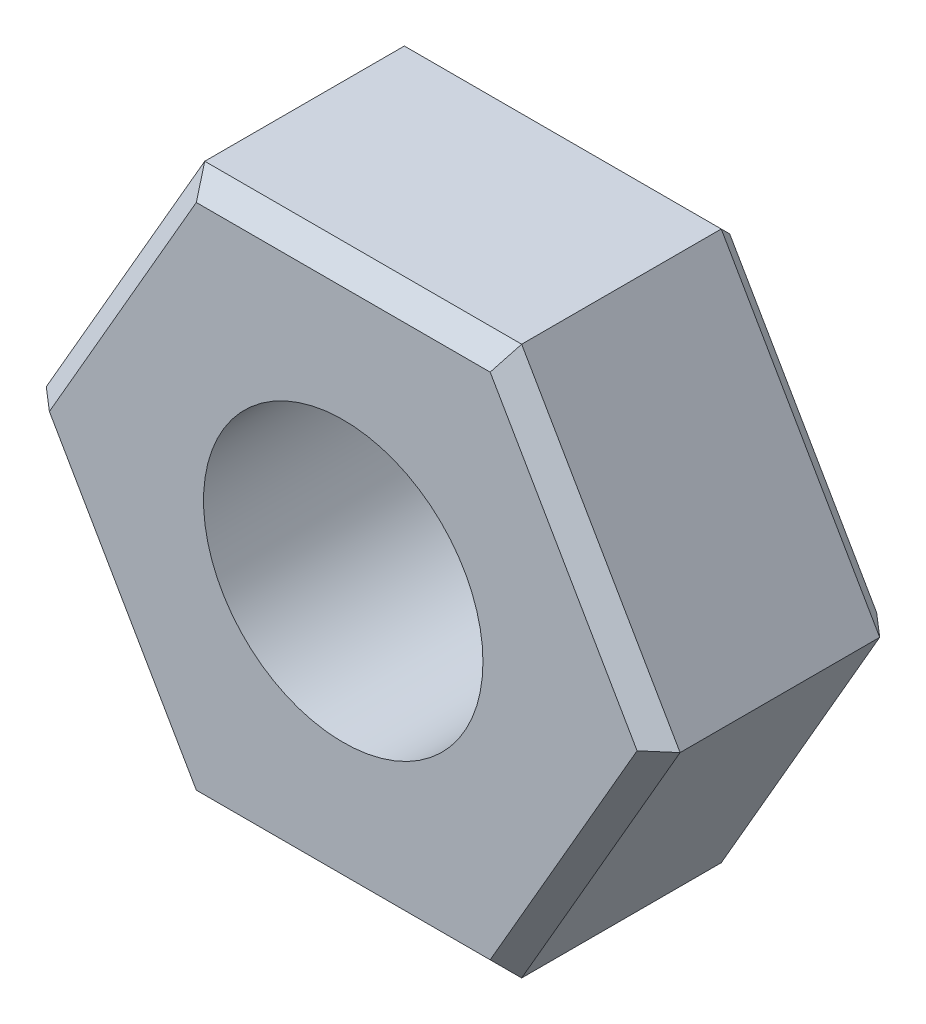
ISO-10303-21;
HEADER;
FILE_DESCRIPTION(('STEP AP214'),'2;1');
FILE_NAME('part.step','',(''),(''),'','','');
FILE_SCHEMA(('AUTOMOTIVE_DESIGN { 1 0 10303 214 1 1 1 1 }'));
ENDSEC;
DATA;
#1=APPLICATION_CONTEXT('core data for automotive mechanical design processes');
#2=APPLICATION_PROTOCOL_DEFINITION('international standard','automotive_design',2000,#1);
#3=PRODUCT_CONTEXT('',#1,'mechanical');
#4=PRODUCT('Part','Part','',(#3));
#5=PRODUCT_RELATED_PRODUCT_CATEGORY('part','',(#4));
#6=PRODUCT_DEFINITION_FORMATION('','',#4);
#7=PRODUCT_DEFINITION_CONTEXT('part definition',#1,'design');
#8=PRODUCT_DEFINITION('design','',#6,#7);
#9=PRODUCT_DEFINITION_SHAPE('','',#8);
#10=(LENGTH_UNIT() NAMED_UNIT(*) SI_UNIT(.MILLI.,.METRE.));
#11=(NAMED_UNIT(*) PLANE_ANGLE_UNIT() SI_UNIT($,.RADIAN.));
#12=(NAMED_UNIT(*) SI_UNIT($,.STERADIAN.) SOLID_ANGLE_UNIT());
#13=UNCERTAINTY_MEASURE_WITH_UNIT(LENGTH_MEASURE(1.E-05),#10,'distance_accuracy_value','');
#14=(GEOMETRIC_REPRESENTATION_CONTEXT(3) GLOBAL_UNCERTAINTY_ASSIGNED_CONTEXT((#13)) GLOBAL_UNIT_ASSIGNED_CONTEXT((#10,
#11,#12)) REPRESENTATION_CONTEXT('',''));
#15=CARTESIAN_POINT('',(0.,0.,0.));
#16=DIRECTION('',(0.,0.,1.));
#17=DIRECTION('',(1.,0.,0.));
#18=AXIS2_PLACEMENT_3D('',#15,#16,#17);
#19=CARTESIAN_POINT('',(1.5877132402715,-2.74999999999998,2.4));
#20=DIRECTION('',(-0.866025403784441,0.499999999999995,0.));
#21=DIRECTION('',(-0.499999999999995,-0.866025403784441,0.));
#22=AXIS2_PLACEMENT_3D('',#19,#20,#21);
#23=PLANE('',#22);
#24=DIRECTION('',(0.,0.,-1.));
#25=VECTOR('',#24,1.);
#26=CARTESIAN_POINT('',(1.5877132402715,-2.74999999999998,2.4));
#27=LINE('',#26,#25);
#28=CARTESIAN_POINT('',(1.5877132402715,-2.74999999999998,2.2));
#29=VERTEX_POINT('',#28);
#30=CARTESIAN_POINT('',(1.5877132402715,-2.74999999999998,0.200000000000002));
#31=VERTEX_POINT('',#30);
#32=EDGE_CURVE('E206',#29,#31,#27,.T.);
#33=ORIENTED_EDGE('',*,*,#32,.T.);
#34=DIRECTION('',(0.499999999999995,0.866025403784441,0.));
#35=VECTOR('',#34,1.);
#36=CARTESIAN_POINT('',(1.5877132402715,-2.74999999999998,0.200000000000002));
#37=LINE('',#36,#35);
#38=CARTESIAN_POINT('',(3.17542648054294,0.,0.200000000000002));
#39=VERTEX_POINT('',#38);
#40=EDGE_CURVE('E152',#31,#39,#37,.T.);
#41=ORIENTED_EDGE('',*,*,#40,.T.);
#42=DIRECTION('',(0.,0.,-1.));
#43=VECTOR('',#42,1.);
#44=CARTESIAN_POINT('',(3.17542648054294,0.,2.4));
#45=LINE('',#44,#43);
#46=CARTESIAN_POINT('',(3.17542648054294,0.,2.2));
#47=VERTEX_POINT('',#46);
#48=EDGE_CURVE('E136',#47,#39,#45,.T.);
#49=ORIENTED_EDGE('',*,*,#48,.F.);
#50=DIRECTION('',(-0.499999999999995,-0.866025403784441,0.));
#51=VECTOR('',#50,1.);
#52=CARTESIAN_POINT('',(1.5877132402715,-2.74999999999998,2.2));
#53=LINE('',#52,#51);
#54=EDGE_CURVE('E149',#47,#29,#53,.T.);
#55=ORIENTED_EDGE('',*,*,#54,.T.);
#56=EDGE_LOOP('',(#33,#41,#49,#55));
#57=FACE_BOUND('',#56,.T.);
#58=ADVANCED_FACE('F40',(#57),#23,.F.);
#59=CARTESIAN_POINT('',(3.17542648054294,0.,2.4));
#60=DIRECTION('',(-0.866025403784438,-0.500000000000001,0.));
#61=DIRECTION('',(0.500000000000001,-0.866025403784438,0.));
#62=AXIS2_PLACEMENT_3D('',#59,#60,#61);
#63=PLANE('',#62);
#64=ORIENTED_EDGE('',*,*,#48,.T.);
#65=DIRECTION('',(-0.500000000000001,0.866025403784438,0.));
#66=VECTOR('',#65,1.);
#67=CARTESIAN_POINT('',(3.17542648054294,0.,0.200000000000002));
#68=LINE('',#67,#66);
#69=CARTESIAN_POINT('',(1.58771324027146,2.75,0.200000000000002));
#70=VERTEX_POINT('',#69);
#71=EDGE_CURVE('E142',#39,#70,#68,.T.);
#72=ORIENTED_EDGE('',*,*,#71,.T.);
#73=DIRECTION('',(0.,0.,-1.));
#74=VECTOR('',#73,1.);
#75=CARTESIAN_POINT('',(1.58771324027146,2.75,2.4));
#76=LINE('',#75,#74);
#77=CARTESIAN_POINT('',(1.58771324027146,2.75,2.2));
#78=VERTEX_POINT('',#77);
#79=EDGE_CURVE('E138',#78,#70,#76,.T.);
#80=ORIENTED_EDGE('',*,*,#79,.F.);
#81=DIRECTION('',(0.500000000000001,-0.866025403784438,0.));
#82=VECTOR('',#81,1.);
#83=CARTESIAN_POINT('',(3.17542648054294,0.,2.2));
#84=LINE('',#83,#82);
#85=EDGE_CURVE('E133',#78,#47,#84,.T.);
#86=ORIENTED_EDGE('',*,*,#85,.T.);
#87=EDGE_LOOP('',(#64,#72,#80,#86));
#88=FACE_BOUND('',#87,.T.);
#89=ADVANCED_FACE('F135',(#88),#63,.F.);
#90=CARTESIAN_POINT('',(1.58771324027146,2.75,2.4));
#91=DIRECTION('',(0.,-1.,0.));
#92=DIRECTION('',(1.,0.,0.));
#93=AXIS2_PLACEMENT_3D('',#90,#91,#92);
#94=PLANE('',#93);
#95=ORIENTED_EDGE('',*,*,#79,.T.);
#96=DIRECTION('',(-1.,0.,0.));
#97=VECTOR('',#96,1.);
#98=CARTESIAN_POINT('',(1.58771324027146,2.75,0.200000000000002));
#99=LINE('',#98,#97);
#100=CARTESIAN_POINT('',(-1.58771324027148,2.74999999999999,0.200000000000002));
#101=VERTEX_POINT('',#100);
#102=EDGE_CURVE('E241',#70,#101,#99,.T.);
#103=ORIENTED_EDGE('',*,*,#102,.T.);
#104=DIRECTION('',(0.,0.,-1.));
#105=VECTOR('',#104,1.);
#106=CARTESIAN_POINT('',(-1.58771324027148,2.74999999999999,2.4));
#107=LINE('',#106,#105);
#108=CARTESIAN_POINT('',(-1.58771324027148,2.74999999999999,2.2));
#109=VERTEX_POINT('',#108);
#110=EDGE_CURVE('E221',#109,#101,#107,.T.);
#111=ORIENTED_EDGE('',*,*,#110,.F.);
#112=DIRECTION('',(1.,0.,0.));
#113=VECTOR('',#112,1.);
#114=CARTESIAN_POINT('',(1.58771324027146,2.75,2.2));
#115=LINE('',#114,#113);
#116=EDGE_CURVE('E239',#109,#78,#115,.T.);
#117=ORIENTED_EDGE('',*,*,#116,.T.);
#118=EDGE_LOOP('',(#95,#103,#111,#117));
#119=FACE_BOUND('',#118,.T.);
#120=ADVANCED_FACE('F299',(#119),#94,.F.);
#121=CARTESIAN_POINT('',(-1.58771324027148,2.74999999999999,2.4));
#122=DIRECTION('',(0.866025403784441,-0.499999999999995,0.));
#123=DIRECTION('',(0.499999999999995,0.866025403784442,0.));
#124=AXIS2_PLACEMENT_3D('',#121,#122,#123);
#125=PLANE('',#124);
#126=ORIENTED_EDGE('',*,*,#110,.T.);
#127=DIRECTION('',(-0.499999999999995,-0.866025403784442,0.));
#128=VECTOR('',#127,1.);
#129=CARTESIAN_POINT('',(-1.58771324027148,2.74999999999999,0.200000000000002));
#130=LINE('',#129,#128);
#131=CARTESIAN_POINT('',(-3.17542648054294,0.,0.200000000000002));
#132=VERTEX_POINT('',#131);
#133=EDGE_CURVE('E245',#101,#132,#130,.T.);
#134=ORIENTED_EDGE('',*,*,#133,.T.);
#135=DIRECTION('',(0.,0.,-1.));
#136=VECTOR('',#135,1.);
#137=CARTESIAN_POINT('',(-3.17542648054294,0.,2.4));
#138=LINE('',#137,#136);
#139=CARTESIAN_POINT('',(-3.17542648054294,0.,2.2));
#140=VERTEX_POINT('',#139);
#141=EDGE_CURVE('E215',#140,#132,#138,.T.);
#142=ORIENTED_EDGE('',*,*,#141,.F.);
#143=DIRECTION('',(0.499999999999995,0.866025403784442,0.));
#144=VECTOR('',#143,1.);
#145=CARTESIAN_POINT('',(-1.58771324027148,2.74999999999999,2.2));
#146=LINE('',#145,#144);
#147=EDGE_CURVE('E243',#140,#109,#146,.T.);
#148=ORIENTED_EDGE('',*,*,#147,.T.);
#149=EDGE_LOOP('',(#126,#134,#142,#148));
#150=FACE_BOUND('',#149,.T.);
#151=ADVANCED_FACE('F304',(#150),#125,.F.);
#152=CARTESIAN_POINT('',(-3.17542648054294,0.,2.4));
#153=DIRECTION('',(0.866025403784434,0.500000000000007,0.));
#154=DIRECTION('',(-0.500000000000007,0.866025403784435,0.));
#155=AXIS2_PLACEMENT_3D('',#152,#153,#154);
#156=PLANE('',#155);
#157=ORIENTED_EDGE('',*,*,#141,.T.);
#158=DIRECTION('',(0.500000000000007,-0.866025403784435,0.));
#159=VECTOR('',#158,1.);
#160=CARTESIAN_POINT('',(-3.17542648054294,0.,0.200000000000002));
#161=LINE('',#160,#159);
#162=CARTESIAN_POINT('',(-1.58771324027145,-2.75000000000001,0.200000000000002));
#163=VERTEX_POINT('',#162);
#164=EDGE_CURVE('E249',#132,#163,#161,.T.);
#165=ORIENTED_EDGE('',*,*,#164,.T.);
#166=DIRECTION('',(0.,0.,-1.));
#167=VECTOR('',#166,1.);
#168=CARTESIAN_POINT('',(-1.58771324027145,-2.75000000000001,2.4));
#169=LINE('',#168,#167);
#170=CARTESIAN_POINT('',(-1.58771324027145,-2.75000000000001,2.2));
#171=VERTEX_POINT('',#170);
#172=EDGE_CURVE('E211',#171,#163,#169,.T.);
#173=ORIENTED_EDGE('',*,*,#172,.F.);
#174=DIRECTION('',(-0.500000000000007,0.866025403784435,0.));
#175=VECTOR('',#174,1.);
#176=CARTESIAN_POINT('',(-3.17542648054294,0.,2.2));
#177=LINE('',#176,#175);
#178=EDGE_CURVE('E247',#171,#140,#177,.T.);
#179=ORIENTED_EDGE('',*,*,#178,.T.);
#180=EDGE_LOOP('',(#157,#165,#173,#179));
#181=FACE_BOUND('',#180,.T.);
#182=ADVANCED_FACE('F276',(#181),#156,.F.);
#183=CARTESIAN_POINT('',(-1.58771324027145,-2.75000000000001,2.4));
#184=DIRECTION('',(0.,1.,0.));
#185=DIRECTION('',(-1.,0.,0.));
#186=AXIS2_PLACEMENT_3D('',#183,#184,#185);
#187=PLANE('',#186);
#188=ORIENTED_EDGE('',*,*,#172,.T.);
#189=DIRECTION('',(1.,0.,0.));
#190=VECTOR('',#189,1.);
#191=CARTESIAN_POINT('',(-1.58771324027145,-2.75000000000001,0.200000000000002));
#192=LINE('',#191,#190);
#193=EDGE_CURVE('E253',#163,#31,#192,.T.);
#194=ORIENTED_EDGE('',*,*,#193,.T.);
#195=ORIENTED_EDGE('',*,*,#32,.F.);
#196=DIRECTION('',(-1.,0.,0.));
#197=VECTOR('',#196,1.);
#198=CARTESIAN_POINT('',(-1.58771324027145,-2.75000000000001,2.2));
#199=LINE('',#198,#197);
#200=EDGE_CURVE('E251',#29,#171,#199,.T.);
#201=ORIENTED_EDGE('',*,*,#200,.T.);
#202=EDGE_LOOP('',(#188,#194,#195,#201));
#203=FACE_BOUND('',#202,.T.);
#204=ADVANCED_FACE('F273',(#203),#187,.F.);
#205=CARTESIAN_POINT('',(0.,0.,2.4));
#206=DIRECTION('',(0.,0.,1.));
#207=DIRECTION('',(1.,0.,0.));
#208=AXIS2_PLACEMENT_3D('',#205,#206,#207);
#209=PLANE('',#208);
#210=CARTESIAN_POINT('',(0.,0.,2.4));
#211=DIRECTION('',(0.,0.,1.));
#212=DIRECTION('',(1.,0.,0.));
#213=AXIS2_PLACEMENT_3D('',#210,#211,#212);
#214=CIRCLE('',#213,1.4);
#215=CARTESIAN_POINT('',(1.4,0.,2.4));
#216=VERTEX_POINT('',#215);
#217=EDGE_CURVE('E160',#216,#216,#214,.T.);
#218=ORIENTED_EDGE('',*,*,#217,.F.);
#219=EDGE_LOOP('',(#218));
#220=FACE_BOUND('',#219,.T.);
#221=DIRECTION('',(1.,0.,0.));
#222=VECTOR('',#221,1.);
#223=CARTESIAN_POINT('',(1.5877132402715,-2.54999999999998,2.4));
#224=LINE('',#223,#222);
#225=CARTESIAN_POINT('',(-1.47224318643352,-2.55000000000001,2.4));
#226=VERTEX_POINT('',#225);
#227=CARTESIAN_POINT('',(1.47224318643358,-2.54999999999998,2.4));
#228=VERTEX_POINT('',#227);
#229=EDGE_CURVE('E255',#226,#228,#224,.T.);
#230=ORIENTED_EDGE('',*,*,#229,.T.);
#231=DIRECTION('',(0.499999999999995,0.866025403784441,0.));
#232=VECTOR('',#231,1.);
#233=CARTESIAN_POINT('',(3.00222139978605,0.0999999999999995,2.4));
#234=LINE('',#233,#232);
#235=CARTESIAN_POINT('',(2.94448637286709,0.,2.4));
#236=VERTEX_POINT('',#235);
#237=EDGE_CURVE('E11',#228,#236,#234,.T.);
#238=ORIENTED_EDGE('',*,*,#237,.T.);
#239=DIRECTION('',(-0.500000000000001,0.866025403784438,0.));
#240=VECTOR('',#239,1.);
#241=CARTESIAN_POINT('',(1.41450815951458,2.65,2.4));
#242=LINE('',#241,#240);
#243=CARTESIAN_POINT('',(1.47224318643354,2.55,2.4));
#244=VERTEX_POINT('',#243);
#245=EDGE_CURVE('E50',#236,#244,#242,.T.);
#246=ORIENTED_EDGE('',*,*,#245,.T.);
#247=DIRECTION('',(-1.,0.,0.));
#248=VECTOR('',#247,1.);
#249=CARTESIAN_POINT('',(-1.58771324027148,2.54999999999999,2.4));
#250=LINE('',#249,#248);
#251=CARTESIAN_POINT('',(-1.47224318643356,2.54999999999999,2.4));
#252=VERTEX_POINT('',#251);
#253=EDGE_CURVE('E261',#244,#252,#250,.T.);
#254=ORIENTED_EDGE('',*,*,#253,.T.);
#255=DIRECTION('',(-0.499999999999995,-0.866025403784442,0.));
#256=VECTOR('',#255,1.);
#257=CARTESIAN_POINT('',(-3.00222139978605,-0.100000000000022,2.4));
#258=LINE('',#257,#256);
#259=CARTESIAN_POINT('',(-2.94448637286709,0.,2.4));
#260=VERTEX_POINT('',#259);
#261=EDGE_CURVE('E259',#252,#260,#258,.T.);
#262=ORIENTED_EDGE('',*,*,#261,.T.);
#263=DIRECTION('',(0.500000000000007,-0.866025403784435,0.));
#264=VECTOR('',#263,1.);
#265=CARTESIAN_POINT('',(-1.41450815951456,-2.65000000000001,2.4));
#266=LINE('',#265,#264);
#267=EDGE_CURVE('E257',#260,#226,#266,.T.);
#268=ORIENTED_EDGE('',*,*,#267,.T.);
#269=EDGE_LOOP('',(#230,#238,#246,#254,#262,#268));
#270=FACE_BOUND('',#269,.T.);
#271=ADVANCED_FACE('F263',(#220,#270),#209,.T.);
#272=CARTESIAN_POINT('',(0.,0.,0.));
#273=DIRECTION('',(0.,0.,1.));
#274=DIRECTION('',(1.,0.,0.));
#275=AXIS2_PLACEMENT_3D('',#272,#273,#274);
#276=PLANE('',#275);
#277=CARTESIAN_POINT('',(0.,0.,0.));
#278=DIRECTION('',(0.,0.,1.));
#279=DIRECTION('',(1.,0.,0.));
#280=AXIS2_PLACEMENT_3D('',#277,#278,#279);
#281=CIRCLE('',#280,1.4);
#282=CARTESIAN_POINT('',(1.4,0.,0.));
#283=VERTEX_POINT('',#282);
#284=EDGE_CURVE('E165',#283,#283,#281,.T.);
#285=ORIENTED_EDGE('',*,*,#284,.T.);
#286=EDGE_LOOP('',(#285));
#287=FACE_BOUND('',#286,.T.);
#288=DIRECTION('',(0.500000000000001,-0.866025403784438,0.));
#289=VECTOR('',#288,1.);
#290=CARTESIAN_POINT('',(2.20836477965031,1.275,0.));
#291=LINE('',#290,#289);
#292=CARTESIAN_POINT('',(1.47224318643354,2.55,0.));
#293=VERTEX_POINT('',#292);
#294=CARTESIAN_POINT('',(2.94448637286709,0.,0.));
#295=VERTEX_POINT('',#294);
#296=EDGE_CURVE('E234',#293,#295,#291,.T.);
#297=ORIENTED_EDGE('',*,*,#296,.T.);
#298=DIRECTION('',(-0.499999999999995,-0.866025403784441,0.));
#299=VECTOR('',#298,1.);
#300=CARTESIAN_POINT('',(2.20836477965033,-1.27499999999999,0.));
#301=LINE('',#300,#299);
#302=CARTESIAN_POINT('',(1.47224318643358,-2.54999999999998,0.));
#303=VERTEX_POINT('',#302);
#304=EDGE_CURVE('E143',#295,#303,#301,.T.);
#305=ORIENTED_EDGE('',*,*,#304,.T.);
#306=DIRECTION('',(-1.,0.,0.));
#307=VECTOR('',#306,1.);
#308=CARTESIAN_POINT('',(0.,-2.55,0.));
#309=LINE('',#308,#307);
#310=CARTESIAN_POINT('',(-1.47224318643352,-2.55000000000001,0.));
#311=VERTEX_POINT('',#310);
#312=EDGE_CURVE('E226',#303,#311,#309,.T.);
#313=ORIENTED_EDGE('',*,*,#312,.T.);
#314=DIRECTION('',(-0.500000000000007,0.866025403784435,0.));
#315=VECTOR('',#314,1.);
#316=CARTESIAN_POINT('',(-2.20836477965031,-1.27500000000002,0.));
#317=LINE('',#316,#315);
#318=CARTESIAN_POINT('',(-2.94448637286709,0.,0.));
#319=VERTEX_POINT('',#318);
#320=EDGE_CURVE('E228',#311,#319,#317,.T.);
#321=ORIENTED_EDGE('',*,*,#320,.T.);
#322=DIRECTION('',(0.499999999999995,0.866025403784442,0.));
#323=VECTOR('',#322,1.);
#324=CARTESIAN_POINT('',(-2.20836477965032,1.27499999999998,0.));
#325=LINE('',#324,#323);
#326=CARTESIAN_POINT('',(-1.47224318643356,2.54999999999999,0.));
#327=VERTEX_POINT('',#326);
#328=EDGE_CURVE('E230',#319,#327,#325,.T.);
#329=ORIENTED_EDGE('',*,*,#328,.T.);
#330=DIRECTION('',(1.,0.,0.));
#331=VECTOR('',#330,1.);
#332=CARTESIAN_POINT('',(0.,2.55,0.));
#333=LINE('',#332,#331);
#334=EDGE_CURVE('E232',#327,#293,#333,.T.);
#335=ORIENTED_EDGE('',*,*,#334,.T.);
#336=EDGE_LOOP('',(#297,#305,#313,#321,#329,#335));
#337=FACE_BOUND('',#336,.T.);
#338=ADVANCED_FACE('F313',(#287,#337),#276,.F.);
#339=CARTESIAN_POINT('',(-1.58771324027148,2.74999999999999,0.200000000000002));
#340=DIRECTION('',(0.612372435695798,-0.353553390593271,0.707106781186547));
#341=DIRECTION('',(-0.499999999999995,-0.866025403784442,0.));
#342=AXIS2_PLACEMENT_3D('',#339,#340,#341);
#343=PLANE('',#342);
#344=DIRECTION('',(0.377964473009231,-0.654653670707974,-0.654653670707978));
#345=VECTOR('',#344,1.);
#346=CARTESIAN_POINT('',(-1.58771324027148,2.74999999999999,0.200000000000002));
#347=LINE('',#346,#345);
#348=EDGE_CURVE('E199',#327,#101,#347,.F.);
#349=ORIENTED_EDGE('',*,*,#348,.F.);
#350=ORIENTED_EDGE('',*,*,#328,.F.);
#351=DIRECTION('',(0.755928946018453,0.,-0.654653670707979));
#352=VECTOR('',#351,1.);
#353=CARTESIAN_POINT('',(-3.17542648054294,0.,0.200000000000002));
#354=LINE('',#353,#352);
#355=EDGE_CURVE('E168',#132,#319,#354,.T.);
#356=ORIENTED_EDGE('',*,*,#355,.F.);
#357=ORIENTED_EDGE('',*,*,#133,.F.);
#358=EDGE_LOOP('',(#349,#350,#356,#357));
#359=FACE_BOUND('',#358,.T.);
#360=ADVANCED_FACE('F316',(#359),#343,.F.);
#361=CARTESIAN_POINT('',(-3.17542648054294,0.,0.200000000000002));
#362=DIRECTION('',(0.612372435695793,0.35355339059328,0.707106781186545));
#363=DIRECTION('',(0.500000000000007,-0.866025403784435,0.));
#364=AXIS2_PLACEMENT_3D('',#361,#362,#363);
#365=PLANE('',#364);
#366=ORIENTED_EDGE('',*,*,#355,.T.);
#367=ORIENTED_EDGE('',*,*,#320,.F.);
#368=DIRECTION('',(0.377964473009219,0.65465367070798,-0.654653670707979));
#369=VECTOR('',#368,1.);
#370=CARTESIAN_POINT('',(-1.58771324027145,-2.75000000000001,0.200000000000002));
#371=LINE('',#370,#369);
#372=EDGE_CURVE('E197',#163,#311,#371,.T.);
#373=ORIENTED_EDGE('',*,*,#372,.F.);
#374=ORIENTED_EDGE('',*,*,#164,.F.);
#375=EDGE_LOOP('',(#366,#367,#373,#374));
#376=FACE_BOUND('',#375,.T.);
#377=ADVANCED_FACE('F278',(#376),#365,.F.);
#378=CARTESIAN_POINT('',(1.58771324027146,2.75,0.200000000000002));
#379=DIRECTION('',(0.,-0.707106781186549,0.707106781186546));
#380=DIRECTION('',(-1.,0.,0.));
#381=AXIS2_PLACEMENT_3D('',#378,#379,#380);
#382=PLANE('',#381);
#383=ORIENTED_EDGE('',*,*,#348,.T.);
#384=ORIENTED_EDGE('',*,*,#102,.F.);
#385=DIRECTION('',(-0.377964473009224,-0.654653670707977,-0.654653670707979));
#386=VECTOR('',#385,1.);
#387=CARTESIAN_POINT('',(1.58771324027146,2.75,0.200000000000002));
#388=LINE('',#387,#386);
#389=EDGE_CURVE('E191',#293,#70,#388,.F.);
#390=ORIENTED_EDGE('',*,*,#389,.F.);
#391=ORIENTED_EDGE('',*,*,#334,.F.);
#392=EDGE_LOOP('',(#383,#384,#390,#391));
#393=FACE_BOUND('',#392,.T.);
#394=ADVANCED_FACE('F336',(#393),#382,.F.);
#395=CARTESIAN_POINT('',(-1.58771324027145,-2.75000000000001,0.200000000000002));
#396=DIRECTION('',(0.,0.707106781186549,0.707106781186546));
#397=DIRECTION('',(1.,0.,0.));
#398=AXIS2_PLACEMENT_3D('',#395,#396,#397);
#399=PLANE('',#398);
#400=ORIENTED_EDGE('',*,*,#372,.T.);
#401=ORIENTED_EDGE('',*,*,#312,.F.);
#402=DIRECTION('',(0.377964473009231,-0.654653670707973,0.654653670707979));
#403=VECTOR('',#402,1.);
#404=CARTESIAN_POINT('',(1.13408088590822,-1.96428571428571,-0.585714285714282));
#405=LINE('',#404,#403);
#406=EDGE_CURVE('E185',#31,#303,#405,.F.);
#407=ORIENTED_EDGE('',*,*,#406,.F.);
#408=ORIENTED_EDGE('',*,*,#193,.F.);
#409=EDGE_LOOP('',(#400,#401,#407,#408));
#410=FACE_BOUND('',#409,.T.);
#411=ADVANCED_FACE('F282',(#410),#399,.F.);
#412=CARTESIAN_POINT('',(3.17542648054294,0.,0.200000000000002));
#413=DIRECTION('',(-0.612372435695796,-0.353553390593276,0.707106781186545));
#414=DIRECTION('',(-0.500000000000001,0.866025403784438,0.));
#415=AXIS2_PLACEMENT_3D('',#412,#413,#414);
#416=PLANE('',#415);
#417=ORIENTED_EDGE('',*,*,#389,.T.);
#418=ORIENTED_EDGE('',*,*,#71,.F.);
#419=DIRECTION('',(-0.755928946018452,0.,-0.65465367070798));
#420=VECTOR('',#419,1.);
#421=CARTESIAN_POINT('',(3.17542648054294,0.,0.200000000000002));
#422=LINE('',#421,#420);
#423=EDGE_CURVE('E180',#295,#39,#422,.F.);
#424=ORIENTED_EDGE('',*,*,#423,.F.);
#425=ORIENTED_EDGE('',*,*,#296,.F.);
#426=EDGE_LOOP('',(#417,#418,#424,#425));
#427=FACE_BOUND('',#426,.T.);
#428=ADVANCED_FACE('F285',(#427),#416,.F.);
#429=CARTESIAN_POINT('',(1.5877132402715,-2.74999999999998,0.200000000000002));
#430=DIRECTION('',(-0.612372435695798,0.353553390593271,0.707106781186546));
#431=DIRECTION('',(0.499999999999995,0.866025403784441,0.));
#432=AXIS2_PLACEMENT_3D('',#429,#430,#431);
#433=PLANE('',#432);
#434=ORIENTED_EDGE('',*,*,#406,.T.);
#435=ORIENTED_EDGE('',*,*,#304,.F.);
#436=ORIENTED_EDGE('',*,*,#423,.T.);
#437=ORIENTED_EDGE('',*,*,#40,.F.);
#438=EDGE_LOOP('',(#434,#435,#436,#437));
#439=FACE_BOUND('',#438,.T.);
#440=ADVANCED_FACE('F283',(#439),#433,.F.);
#441=CARTESIAN_POINT('',(-2.20836477965032,1.27499999999999,2.4));
#442=DIRECTION('',(-0.612372435695796,0.35355339059327,0.707106781186548));
#443=DIRECTION('',(0.499999999999995,0.866025403784442,0.));
#444=AXIS2_PLACEMENT_3D('',#441,#442,#443);
#445=PLANE('',#444);
#446=DIRECTION('',(-0.377964473009231,0.654653670707975,-0.654653670707977));
#447=VECTOR('',#446,1.);
#448=CARTESIAN_POINT('',(-1.26192273122876,2.18571428571428,2.76428571428571));
#449=LINE('',#448,#447);
#450=EDGE_CURVE('E174',#109,#252,#449,.F.);
#451=ORIENTED_EDGE('',*,*,#450,.F.);
#452=ORIENTED_EDGE('',*,*,#147,.F.);
#453=DIRECTION('',(-0.755928946018455,0.,-0.654653670707977));
#454=VECTOR('',#453,1.);
#455=CARTESIAN_POINT('',(-2.5238454624575,0.,2.76428571428572));
#456=LINE('',#455,#454);
#457=EDGE_CURVE('E45',#260,#140,#456,.T.);
#458=ORIENTED_EDGE('',*,*,#457,.F.);
#459=ORIENTED_EDGE('',*,*,#261,.F.);
#460=EDGE_LOOP('',(#451,#452,#458,#459));
#461=FACE_BOUND('',#460,.T.);
#462=ADVANCED_FACE('F43',(#461),#445,.T.);
#463=CARTESIAN_POINT('',(-2.20836477965031,-1.27500000000002,2.4));
#464=DIRECTION('',(-0.612372435695792,-0.353553390593279,0.707106781186547));
#465=DIRECTION('',(-0.500000000000007,0.866025403784435,0.));
#466=AXIS2_PLACEMENT_3D('',#463,#464,#465);
#467=PLANE('',#466);
#468=ORIENTED_EDGE('',*,*,#457,.T.);
#469=ORIENTED_EDGE('',*,*,#178,.F.);
#470=DIRECTION('',(-0.37796447300922,-0.654653670707981,-0.654653670707977));
#471=VECTOR('',#470,1.);
#472=CARTESIAN_POINT('',(-1.26192273122873,-2.18571428571429,2.76428571428571));
#473=LINE('',#472,#471);
#474=EDGE_CURVE('E172',#226,#171,#473,.T.);
#475=ORIENTED_EDGE('',*,*,#474,.F.);
#476=ORIENTED_EDGE('',*,*,#267,.F.);
#477=EDGE_LOOP('',(#468,#469,#475,#476));
#478=FACE_BOUND('',#477,.T.);
#479=ADVANCED_FACE('F267',(#478),#467,.T.);
#480=CARTESIAN_POINT('',(0.,2.55,2.4));
#481=DIRECTION('',(0.,0.707106781186547,0.707106781186547));
#482=DIRECTION('',(1.,0.,0.));
#483=AXIS2_PLACEMENT_3D('',#480,#481,#482);
#484=PLANE('',#483);
#485=ORIENTED_EDGE('',*,*,#450,.T.);
#486=ORIENTED_EDGE('',*,*,#253,.F.);
#487=DIRECTION('',(0.377964473009225,0.654653670707978,-0.654653670707977));
#488=VECTOR('',#487,1.);
#489=CARTESIAN_POINT('',(1.26192273122875,2.18571428571429,2.76428571428571));
#490=LINE('',#489,#488);
#491=EDGE_CURVE('E162',#78,#244,#490,.F.);
#492=ORIENTED_EDGE('',*,*,#491,.F.);
#493=ORIENTED_EDGE('',*,*,#116,.F.);
#494=EDGE_LOOP('',(#485,#486,#492,#493));
#495=FACE_BOUND('',#494,.T.);
#496=ADVANCED_FACE('F373',(#495),#484,.T.);
#497=CARTESIAN_POINT('',(0.,-2.55,2.4));
#498=DIRECTION('',(0.,-0.707106781186547,0.707106781186547));
#499=DIRECTION('',(-1.,0.,0.));
#500=AXIS2_PLACEMENT_3D('',#497,#498,#499);
#501=PLANE('',#500);
#502=ORIENTED_EDGE('',*,*,#474,.T.);
#503=ORIENTED_EDGE('',*,*,#200,.F.);
#504=DIRECTION('',(-0.377964473009231,0.654653670707974,0.654653670707978));
#505=VECTOR('',#504,1.);
#506=CARTESIAN_POINT('',(1.26192273122878,-2.18571428571427,2.76428571428571));
#507=LINE('',#506,#505);
#508=EDGE_CURVE('E156',#228,#29,#507,.F.);
#509=ORIENTED_EDGE('',*,*,#508,.F.);
#510=ORIENTED_EDGE('',*,*,#229,.F.);
#511=EDGE_LOOP('',(#502,#503,#509,#510));
#512=FACE_BOUND('',#511,.T.);
#513=ADVANCED_FACE('F270',(#512),#501,.T.);
#514=CARTESIAN_POINT('',(2.20836477965031,1.275,2.4));
#515=DIRECTION('',(0.612372435695795,0.353553390593275,0.707106781186547));
#516=DIRECTION('',(0.500000000000001,-0.866025403784438,0.));
#517=AXIS2_PLACEMENT_3D('',#514,#515,#516);
#518=PLANE('',#517);
#519=ORIENTED_EDGE('',*,*,#491,.T.);
#520=ORIENTED_EDGE('',*,*,#245,.F.);
#521=DIRECTION('',(0.755928946018454,0.,-0.654653670707978));
#522=VECTOR('',#521,1.);
#523=CARTESIAN_POINT('',(2.52384546245751,0.,2.76428571428571));
#524=LINE('',#523,#522);
#525=EDGE_CURVE('E58',#47,#236,#524,.F.);
#526=ORIENTED_EDGE('',*,*,#525,.F.);
#527=ORIENTED_EDGE('',*,*,#85,.F.);
#528=EDGE_LOOP('',(#519,#520,#526,#527));
#529=FACE_BOUND('',#528,.T.);
#530=ADVANCED_FACE('F159',(#529),#518,.T.);
#531=CARTESIAN_POINT('',(2.20836477965033,-1.27499999999999,2.4));
#532=DIRECTION('',(0.612372435695797,-0.353553390593271,0.707106781186547));
#533=DIRECTION('',(-0.499999999999995,-0.866025403784441,0.));
#534=AXIS2_PLACEMENT_3D('',#531,#532,#533);
#535=PLANE('',#534);
#536=ORIENTED_EDGE('',*,*,#508,.T.);
#537=ORIENTED_EDGE('',*,*,#54,.F.);
#538=ORIENTED_EDGE('',*,*,#525,.T.);
#539=ORIENTED_EDGE('',*,*,#237,.F.);
#540=EDGE_LOOP('',(#536,#537,#538,#539));
#541=FACE_BOUND('',#540,.T.);
#542=ADVANCED_FACE('F154',(#541),#535,.T.);
#543=CARTESIAN_POINT('',(0.,0.,2.4));
#544=DIRECTION('',(0.,0.,-1.));
#545=DIRECTION('',(-1.,0.,0.));
#546=AXIS2_PLACEMENT_3D('',#543,#544,#545);
#547=CYLINDRICAL_SURFACE('',#546,1.4);
#548=ORIENTED_EDGE('',*,*,#217,.T.);
#549=EDGE_LOOP('',(#548));
#550=FACE_BOUND('',#549,.T.);
#551=ORIENTED_EDGE('',*,*,#284,.F.);
#552=EDGE_LOOP('',(#551));
#553=FACE_BOUND('',#552,.T.);
#554=ADVANCED_FACE('F321',(#550,#553),#547,.F.);
#555=CLOSED_SHELL('',(#58,#89,#120,#151,#182,#204,#271,#338,#360,#377,#394,#411,#428,#440,#462,
#479,#496,#513,#530,#542,#554));
#556=MANIFOLD_SOLID_BREP('B2',#555);
#557=ADVANCED_BREP_SHAPE_REPRESENTATION('',(#18,#556),#14);
#558=SHAPE_DEFINITION_REPRESENTATION(#9,#557);
ENDSEC;
END-ISO-10303-21;
